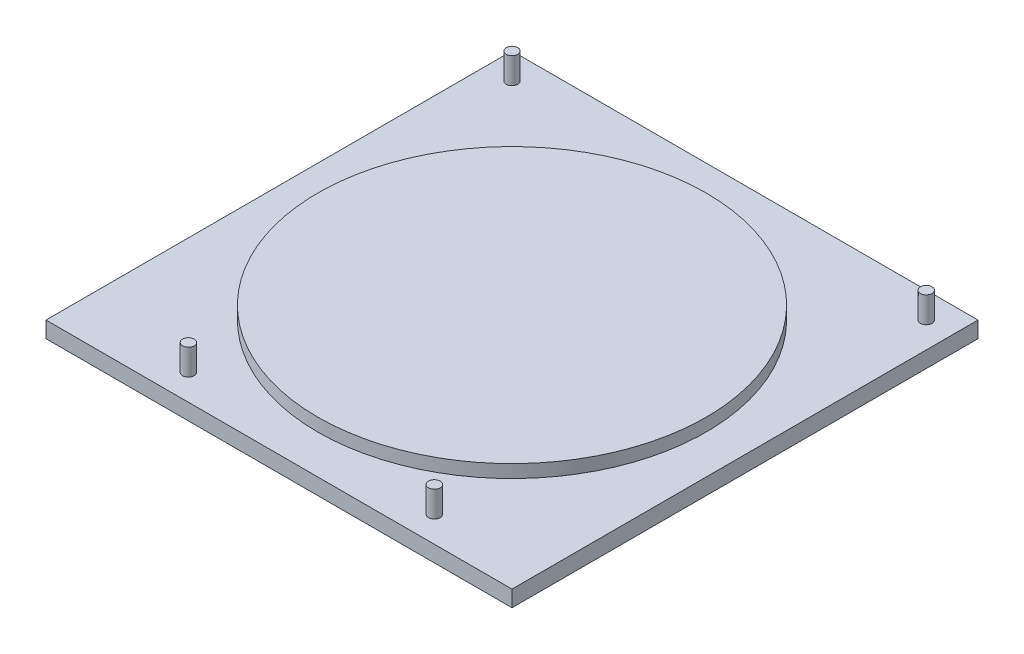
ISO-10303-21;
HEADER;
FILE_DESCRIPTION(('STEP AP214'),'2;1');
FILE_NAME('part.step','',(''),(''),'','','');
FILE_SCHEMA(('AUTOMOTIVE_DESIGN { 1 0 10303 214 1 1 1 1 }'));
ENDSEC;
DATA;
#1=APPLICATION_CONTEXT('core data for automotive mechanical design processes');
#2=APPLICATION_PROTOCOL_DEFINITION('international standard','automotive_design',2000,#1);
#3=PRODUCT_CONTEXT('',#1,'mechanical');
#4=PRODUCT('Part','Part','',(#3));
#5=PRODUCT_RELATED_PRODUCT_CATEGORY('part','',(#4));
#6=PRODUCT_DEFINITION_FORMATION('','',#4);
#7=PRODUCT_DEFINITION_CONTEXT('part definition',#1,'design');
#8=PRODUCT_DEFINITION('design','',#6,#7);
#9=PRODUCT_DEFINITION_SHAPE('','',#8);
#10=(LENGTH_UNIT() NAMED_UNIT(*) SI_UNIT(.MILLI.,.METRE.));
#11=(NAMED_UNIT(*) PLANE_ANGLE_UNIT() SI_UNIT($,.RADIAN.));
#12=(NAMED_UNIT(*) SI_UNIT($,.STERADIAN.) SOLID_ANGLE_UNIT());
#13=UNCERTAINTY_MEASURE_WITH_UNIT(LENGTH_MEASURE(1.E-05),#10,'distance_accuracy_value','');
#14=(GEOMETRIC_REPRESENTATION_CONTEXT(3) GLOBAL_UNCERTAINTY_ASSIGNED_CONTEXT((#13)) GLOBAL_UNIT_ASSIGNED_CONTEXT((#10,
#11,#12)) REPRESENTATION_CONTEXT('',''));
#15=CARTESIAN_POINT('',(0.,0.,0.));
#16=DIRECTION('',(0.,0.,1.));
#17=DIRECTION('',(1.,0.,0.));
#18=AXIS2_PLACEMENT_3D('',#15,#16,#17);
#19=CARTESIAN_POINT('',(-13.556511627907,3.175,-42.9289534883721));
#20=DIRECTION('',(1.,0.,0.));
#21=DIRECTION('',(0.,0.,-1.));
#22=AXIS2_PLACEMENT_3D('',#19,#20,#21);
#23=PLANE('',#22);
#24=DIRECTION('',(0.,0.,1.));
#25=VECTOR('',#24,1.);
#26=CARTESIAN_POINT('',(-13.556511627907,0.,-42.9289534883721));
#27=LINE('',#26,#25);
#28=CARTESIAN_POINT('',(-13.556511627907,0.,-42.9289534883721));
#29=VERTEX_POINT('',#28);
#30=CARTESIAN_POINT('',(-13.556511627907,0.,48.5110465116279));
#31=VERTEX_POINT('',#30);
#32=EDGE_CURVE('E114',#29,#31,#27,.T.);
#33=ORIENTED_EDGE('',*,*,#32,.T.);
#34=DIRECTION('',(0.,-1.,0.));
#35=VECTOR('',#34,1.);
#36=CARTESIAN_POINT('',(-13.556511627907,3.175,48.5110465116279));
#37=LINE('',#36,#35);
#38=CARTESIAN_POINT('',(-13.556511627907,3.175,48.5110465116279));
#39=VERTEX_POINT('',#38);
#40=EDGE_CURVE('E46',#39,#31,#37,.T.);
#41=ORIENTED_EDGE('',*,*,#40,.F.);
#42=DIRECTION('',(0.,0.,1.));
#43=VECTOR('',#42,1.);
#44=CARTESIAN_POINT('',(-13.556511627907,3.175,-42.9289534883721));
#45=LINE('',#44,#43);
#46=CARTESIAN_POINT('',(-13.556511627907,3.175,-42.9289534883721));
#47=VERTEX_POINT('',#46);
#48=EDGE_CURVE('E97',#47,#39,#45,.T.);
#49=ORIENTED_EDGE('',*,*,#48,.F.);
#50=DIRECTION('',(0.,-1.,0.));
#51=VECTOR('',#50,1.);
#52=CARTESIAN_POINT('',(-13.556511627907,3.175,-42.9289534883721));
#53=LINE('',#52,#51);
#54=EDGE_CURVE('E110',#47,#29,#53,.T.);
#55=ORIENTED_EDGE('',*,*,#54,.T.);
#56=EDGE_LOOP('',(#33,#41,#49,#55));
#57=FACE_BOUND('',#56,.T.);
#58=ADVANCED_FACE('F43',(#57),#23,.F.);
#59=CARTESIAN_POINT('',(-13.556511627907,3.175,48.5110465116279));
#60=DIRECTION('',(0.,0.,-1.));
#61=DIRECTION('',(-1.,0.,0.));
#62=AXIS2_PLACEMENT_3D('',#59,#60,#61);
#63=PLANE('',#62);
#64=DIRECTION('',(1.,0.,0.));
#65=VECTOR('',#64,1.);
#66=CARTESIAN_POINT('',(-13.556511627907,0.,48.5110465116279));
#67=LINE('',#66,#65);
#68=CARTESIAN_POINT('',(77.883488372093,0.,48.5110465116279));
#69=VERTEX_POINT('',#68);
#70=EDGE_CURVE('E103',#31,#69,#67,.T.);
#71=ORIENTED_EDGE('',*,*,#70,.T.);
#72=DIRECTION('',(0.,-1.,0.));
#73=VECTOR('',#72,1.);
#74=CARTESIAN_POINT('',(77.883488372093,3.175,48.5110465116279));
#75=LINE('',#74,#73);
#76=CARTESIAN_POINT('',(77.883488372093,3.175,48.5110465116279));
#77=VERTEX_POINT('',#76);
#78=EDGE_CURVE('E101',#77,#69,#75,.T.);
#79=ORIENTED_EDGE('',*,*,#78,.F.);
#80=DIRECTION('',(1.,0.,0.));
#81=VECTOR('',#80,1.);
#82=CARTESIAN_POINT('',(-13.556511627907,3.175,48.5110465116279));
#83=LINE('',#82,#81);
#84=EDGE_CURVE('E92',#39,#77,#83,.T.);
#85=ORIENTED_EDGE('',*,*,#84,.F.);
#86=ORIENTED_EDGE('',*,*,#40,.T.);
#87=EDGE_LOOP('',(#71,#79,#85,#86));
#88=FACE_BOUND('',#87,.T.);
#89=ADVANCED_FACE('F102',(#88),#63,.F.);
#90=CARTESIAN_POINT('',(77.883488372093,3.175,-42.9289534883721));
#91=DIRECTION('',(-1.,0.,0.));
#92=DIRECTION('',(0.,0.,1.));
#93=AXIS2_PLACEMENT_3D('',#90,#91,#92);
#94=PLANE('',#93);
#95=DIRECTION('',(0.,0.,-1.));
#96=VECTOR('',#95,1.);
#97=CARTESIAN_POINT('',(77.883488372093,0.,-42.9289534883721));
#98=LINE('',#97,#96);
#99=CARTESIAN_POINT('',(77.883488372093,0.,-42.9289534883721));
#100=VERTEX_POINT('',#99);
#101=EDGE_CURVE('E78',#69,#100,#98,.T.);
#102=ORIENTED_EDGE('',*,*,#101,.T.);
#103=DIRECTION('',(0.,-1.,0.));
#104=VECTOR('',#103,1.);
#105=CARTESIAN_POINT('',(77.883488372093,3.175,-42.9289534883721));
#106=LINE('',#105,#104);
#107=CARTESIAN_POINT('',(77.883488372093,3.175,-42.9289534883721));
#108=VERTEX_POINT('',#107);
#109=EDGE_CURVE('E105',#108,#100,#106,.T.);
#110=ORIENTED_EDGE('',*,*,#109,.F.);
#111=DIRECTION('',(0.,0.,-1.));
#112=VECTOR('',#111,1.);
#113=CARTESIAN_POINT('',(77.883488372093,3.175,-42.9289534883721));
#114=LINE('',#113,#112);
#115=EDGE_CURVE('E95',#77,#108,#114,.T.);
#116=ORIENTED_EDGE('',*,*,#115,.F.);
#117=ORIENTED_EDGE('',*,*,#78,.T.);
#118=EDGE_LOOP('',(#102,#110,#116,#117));
#119=FACE_BOUND('',#118,.T.);
#120=ADVANCED_FACE('F106',(#119),#94,.F.);
#121=CARTESIAN_POINT('',(-13.556511627907,3.175,-42.9289534883721));
#122=DIRECTION('',(0.,0.,1.));
#123=DIRECTION('',(1.,0.,0.));
#124=AXIS2_PLACEMENT_3D('',#121,#122,#123);
#125=PLANE('',#124);
#126=DIRECTION('',(-1.,0.,0.));
#127=VECTOR('',#126,1.);
#128=CARTESIAN_POINT('',(-13.556511627907,0.,-42.9289534883721));
#129=LINE('',#128,#127);
#130=EDGE_CURVE('E84',#100,#29,#129,.T.);
#131=ORIENTED_EDGE('',*,*,#130,.T.);
#132=ORIENTED_EDGE('',*,*,#54,.F.);
#133=DIRECTION('',(-1.,0.,0.));
#134=VECTOR('',#133,1.);
#135=CARTESIAN_POINT('',(-13.556511627907,3.175,-42.9289534883721));
#136=LINE('',#135,#134);
#137=EDGE_CURVE('E61',#108,#47,#136,.T.);
#138=ORIENTED_EDGE('',*,*,#137,.F.);
#139=ORIENTED_EDGE('',*,*,#109,.T.);
#140=EDGE_LOOP('',(#131,#132,#138,#139));
#141=FACE_BOUND('',#140,.T.);
#142=ADVANCED_FACE('F128',(#141),#125,.F.);
#143=CARTESIAN_POINT('',(0.,3.175,0.));
#144=DIRECTION('',(0.,1.,0.));
#145=DIRECTION('',(0.,0.,1.));
#146=AXIS2_PLACEMENT_3D('',#143,#144,#145);
#147=PLANE('',#146);
#148=CARTESIAN_POINT('',(72.803488372093,3.175,-37.8489534883721));
#149=DIRECTION('',(0.,1.,0.));
#150=DIRECTION('',(0.,0.,1.));
#151=AXIS2_PLACEMENT_3D('',#148,#149,#150);
#152=CIRCLE('',#151,1.143);
#153=CARTESIAN_POINT('',(72.803488372093,3.175,-36.7059534883721));
#154=VERTEX_POINT('',#153);
#155=EDGE_CURVE('E159',#154,#154,#152,.T.);
#156=ORIENTED_EDGE('',*,*,#155,.F.);
#157=EDGE_LOOP('',(#156));
#158=FACE_BOUND('',#157,.T.);
#159=CARTESIAN_POINT('',(-8.476511627907,3.175,-37.8489534883721));
#160=DIRECTION('',(0.,1.,0.));
#161=DIRECTION('',(0.,0.,1.));
#162=AXIS2_PLACEMENT_3D('',#159,#160,#161);
#163=CIRCLE('',#162,1.143);
#164=CARTESIAN_POINT('',(-8.476511627907,3.175,-36.7059534883721));
#165=VERTEX_POINT('',#164);
#166=EDGE_CURVE('E155',#165,#165,#163,.T.);
#167=ORIENTED_EDGE('',*,*,#166,.F.);
#168=EDGE_LOOP('',(#167));
#169=FACE_BOUND('',#168,.T.);
#170=CARTESIAN_POINT('',(57.563488372093,3.175,43.4310465116279));
#171=DIRECTION('',(0.,1.,0.));
#172=DIRECTION('',(0.,0.,1.));
#173=AXIS2_PLACEMENT_3D('',#170,#171,#172);
#174=CIRCLE('',#173,1.143);
#175=CARTESIAN_POINT('',(57.563488372093,3.175,44.5740465116279));
#176=VERTEX_POINT('',#175);
#177=EDGE_CURVE('E143',#176,#176,#174,.T.);
#178=ORIENTED_EDGE('',*,*,#177,.F.);
#179=EDGE_LOOP('',(#178));
#180=FACE_BOUND('',#179,.T.);
#181=CARTESIAN_POINT('',(9.30348837209301,3.175,43.4310465116279));
#182=DIRECTION('',(0.,1.,0.));
#183=DIRECTION('',(0.,0.,1.));
#184=AXIS2_PLACEMENT_3D('',#181,#182,#183);
#185=CIRCLE('',#184,1.143);
#186=CARTESIAN_POINT('',(9.30348837209301,3.175,44.5740465116279));
#187=VERTEX_POINT('',#186);
#188=EDGE_CURVE('E139',#187,#187,#185,.T.);
#189=ORIENTED_EDGE('',*,*,#188,.F.);
#190=EDGE_LOOP('',(#189));
#191=FACE_BOUND('',#190,.T.);
#192=CARTESIAN_POINT('',(32.163488372093,3.175,2.79104651162791));
#193=DIRECTION('',(0.,1.,0.));
#194=DIRECTION('',(0.,0.,1.));
#195=AXIS2_PLACEMENT_3D('',#192,#193,#194);
#196=CIRCLE('',#195,38.1);
#197=CARTESIAN_POINT('',(32.163488372093,3.175,40.8910465116279));
#198=VERTEX_POINT('',#197);
#199=EDGE_CURVE('E11',#198,#198,#196,.T.);
#200=ORIENTED_EDGE('',*,*,#199,.F.);
#201=EDGE_LOOP('',(#200));
#202=FACE_BOUND('',#201,.T.);
#203=ORIENTED_EDGE('',*,*,#48,.T.);
#204=ORIENTED_EDGE('',*,*,#84,.T.);
#205=ORIENTED_EDGE('',*,*,#115,.T.);
#206=ORIENTED_EDGE('',*,*,#137,.T.);
#207=EDGE_LOOP('',(#203,#204,#205,#206));
#208=FACE_BOUND('',#207,.T.);
#209=ADVANCED_FACE('F93',(#158,#169,#180,#191,#202,#208),#147,.T.);
#210=CARTESIAN_POINT('',(0.,0.,0.));
#211=DIRECTION('',(0.,1.,0.));
#212=DIRECTION('',(0.,0.,1.));
#213=AXIS2_PLACEMENT_3D('',#210,#211,#212);
#214=PLANE('',#213);
#215=ORIENTED_EDGE('',*,*,#32,.F.);
#216=ORIENTED_EDGE('',*,*,#130,.F.);
#217=ORIENTED_EDGE('',*,*,#101,.F.);
#218=ORIENTED_EDGE('',*,*,#70,.F.);
#219=EDGE_LOOP('',(#215,#216,#217,#218));
#220=FACE_BOUND('',#219,.T.);
#221=ADVANCED_FACE('F131',(#220),#214,.F.);
#222=CARTESIAN_POINT('',(32.163488372093,5.715,2.79104651162791));
#223=DIRECTION('',(0.,-1.,0.));
#224=DIRECTION('',(0.,0.,-1.));
#225=AXIS2_PLACEMENT_3D('',#222,#223,#224);
#226=CYLINDRICAL_SURFACE('',#225,38.1);
#227=CARTESIAN_POINT('',(32.163488372093,5.715,2.79104651162791));
#228=DIRECTION('',(0.,1.,0.));
#229=DIRECTION('',(0.,0.,1.));
#230=AXIS2_PLACEMENT_3D('',#227,#228,#229);
#231=CIRCLE('',#230,38.1);
#232=CARTESIAN_POINT('',(32.163488372093,5.715,40.8910465116279));
#233=VERTEX_POINT('',#232);
#234=EDGE_CURVE('E118',#233,#233,#231,.T.);
#235=ORIENTED_EDGE('',*,*,#234,.F.);
#236=EDGE_LOOP('',(#235));
#237=FACE_BOUND('',#236,.T.);
#238=ORIENTED_EDGE('',*,*,#199,.T.);
#239=EDGE_LOOP('',(#238));
#240=FACE_BOUND('',#239,.T.);
#241=ADVANCED_FACE('F184',(#237,#240),#226,.T.);
#242=CARTESIAN_POINT('',(32.163488372093,5.715,2.79104651162791));
#243=DIRECTION('',(0.,1.,0.));
#244=DIRECTION('',(0.,0.,1.));
#245=AXIS2_PLACEMENT_3D('',#242,#243,#244);
#246=PLANE('',#245);
#247=ORIENTED_EDGE('',*,*,#234,.T.);
#248=EDGE_LOOP('',(#247));
#249=FACE_BOUND('',#248,.T.);
#250=ADVANCED_FACE('F186',(#249),#246,.T.);
#251=CARTESIAN_POINT('',(9.30348837209301,8.255,43.4310465116279));
#252=DIRECTION('',(0.,-1.,0.));
#253=DIRECTION('',(0.,0.,-1.));
#254=AXIS2_PLACEMENT_3D('',#251,#252,#253);
#255=CYLINDRICAL_SURFACE('',#254,1.143);
#256=CARTESIAN_POINT('',(9.30348837209301,8.255,43.4310465116279));
#257=DIRECTION('',(0.,1.,0.));
#258=DIRECTION('',(0.,0.,1.));
#259=AXIS2_PLACEMENT_3D('',#256,#257,#258);
#260=CIRCLE('',#259,1.143);
#261=CARTESIAN_POINT('',(9.30348837209301,8.255,44.5740465116279));
#262=VERTEX_POINT('',#261);
#263=EDGE_CURVE('E138',#262,#262,#260,.T.);
#264=ORIENTED_EDGE('',*,*,#263,.F.);
#265=EDGE_LOOP('',(#264));
#266=FACE_BOUND('',#265,.T.);
#267=ORIENTED_EDGE('',*,*,#188,.T.);
#268=EDGE_LOOP('',(#267));
#269=FACE_BOUND('',#268,.T.);
#270=ADVANCED_FACE('F193',(#266,#269),#255,.T.);
#271=CARTESIAN_POINT('',(9.30348837209301,8.255,43.4310465116279));
#272=DIRECTION('',(0.,1.,0.));
#273=DIRECTION('',(0.,0.,1.));
#274=AXIS2_PLACEMENT_3D('',#271,#272,#273);
#275=PLANE('',#274);
#276=ORIENTED_EDGE('',*,*,#263,.T.);
#277=EDGE_LOOP('',(#276));
#278=FACE_BOUND('',#277,.T.);
#279=ADVANCED_FACE('F244',(#278),#275,.T.);
#280=CARTESIAN_POINT('',(57.563488372093,8.255,43.4310465116279));
#281=DIRECTION('',(0.,-1.,0.));
#282=DIRECTION('',(0.,0.,-1.));
#283=AXIS2_PLACEMENT_3D('',#280,#281,#282);
#284=CYLINDRICAL_SURFACE('',#283,1.143);
#285=CARTESIAN_POINT('',(57.563488372093,8.255,43.4310465116279));
#286=DIRECTION('',(0.,1.,0.));
#287=DIRECTION('',(0.,0.,1.));
#288=AXIS2_PLACEMENT_3D('',#285,#286,#287);
#289=CIRCLE('',#288,1.143);
#290=CARTESIAN_POINT('',(57.563488372093,8.255,44.5740465116279));
#291=VERTEX_POINT('',#290);
#292=EDGE_CURVE('E147',#291,#291,#289,.T.);
#293=ORIENTED_EDGE('',*,*,#292,.F.);
#294=EDGE_LOOP('',(#293));
#295=FACE_BOUND('',#294,.T.);
#296=ORIENTED_EDGE('',*,*,#177,.T.);
#297=EDGE_LOOP('',(#296));
#298=FACE_BOUND('',#297,.T.);
#299=ADVANCED_FACE('F255',(#295,#298),#284,.T.);
#300=CARTESIAN_POINT('',(57.563488372093,8.255,43.4310465116279));
#301=DIRECTION('',(0.,1.,0.));
#302=DIRECTION('',(0.,0.,1.));
#303=AXIS2_PLACEMENT_3D('',#300,#301,#302);
#304=PLANE('',#303);
#305=ORIENTED_EDGE('',*,*,#292,.T.);
#306=EDGE_LOOP('',(#305));
#307=FACE_BOUND('',#306,.T.);
#308=ADVANCED_FACE('F265',(#307),#304,.T.);
#309=CARTESIAN_POINT('',(-8.476511627907,8.255,-37.8489534883721));
#310=DIRECTION('',(0.,-1.,0.));
#311=DIRECTION('',(0.,0.,-1.));
#312=AXIS2_PLACEMENT_3D('',#309,#310,#311);
#313=CYLINDRICAL_SURFACE('',#312,1.143);
#314=CARTESIAN_POINT('',(-8.476511627907,8.255,-37.8489534883721));
#315=DIRECTION('',(0.,1.,0.));
#316=DIRECTION('',(0.,0.,1.));
#317=AXIS2_PLACEMENT_3D('',#314,#315,#316);
#318=CIRCLE('',#317,1.143);
#319=CARTESIAN_POINT('',(-8.476511627907,8.255,-36.7059534883721));
#320=VERTEX_POINT('',#319);
#321=EDGE_CURVE('E151',#320,#320,#318,.T.);
#322=ORIENTED_EDGE('',*,*,#321,.F.);
#323=EDGE_LOOP('',(#322));
#324=FACE_BOUND('',#323,.T.);
#325=ORIENTED_EDGE('',*,*,#166,.T.);
#326=EDGE_LOOP('',(#325));
#327=FACE_BOUND('',#326,.T.);
#328=ADVANCED_FACE('F275',(#324,#327),#313,.T.);
#329=CARTESIAN_POINT('',(-8.476511627907,8.255,-37.8489534883721));
#330=DIRECTION('',(0.,1.,0.));
#331=DIRECTION('',(0.,0.,1.));
#332=AXIS2_PLACEMENT_3D('',#329,#330,#331);
#333=PLANE('',#332);
#334=ORIENTED_EDGE('',*,*,#321,.T.);
#335=EDGE_LOOP('',(#334));
#336=FACE_BOUND('',#335,.T.);
#337=ADVANCED_FACE('F286',(#336),#333,.T.);
#338=CARTESIAN_POINT('',(72.803488372093,8.255,-37.8489534883721));
#339=DIRECTION('',(0.,-1.,0.));
#340=DIRECTION('',(0.,0.,-1.));
#341=AXIS2_PLACEMENT_3D('',#338,#339,#340);
#342=CYLINDRICAL_SURFACE('',#341,1.143);
#343=CARTESIAN_POINT('',(72.803488372093,8.255,-37.8489534883721));
#344=DIRECTION('',(0.,1.,0.));
#345=DIRECTION('',(0.,0.,1.));
#346=AXIS2_PLACEMENT_3D('',#343,#344,#345);
#347=CIRCLE('',#346,1.143);
#348=CARTESIAN_POINT('',(72.803488372093,8.255,-36.7059534883721));
#349=VERTEX_POINT('',#348);
#350=EDGE_CURVE('E163',#349,#349,#347,.T.);
#351=ORIENTED_EDGE('',*,*,#350,.F.);
#352=EDGE_LOOP('',(#351));
#353=FACE_BOUND('',#352,.T.);
#354=ORIENTED_EDGE('',*,*,#155,.T.);
#355=EDGE_LOOP('',(#354));
#356=FACE_BOUND('',#355,.T.);
#357=ADVANCED_FACE('F171',(#353,#356),#342,.T.);
#358=CARTESIAN_POINT('',(72.803488372093,8.255,-37.8489534883721));
#359=DIRECTION('',(0.,1.,0.));
#360=DIRECTION('',(0.,0.,1.));
#361=AXIS2_PLACEMENT_3D('',#358,#359,#360);
#362=PLANE('',#361);
#363=ORIENTED_EDGE('',*,*,#350,.T.);
#364=EDGE_LOOP('',(#363));
#365=FACE_BOUND('',#364,.T.);
#366=ADVANCED_FACE('F300',(#365),#362,.T.);
#367=CLOSED_SHELL('',(#58,#89,#120,#142,#209,#221,#241,#250,#270,#279,#299,#308,#328,#337,#357,#366));
#368=MANIFOLD_SOLID_BREP('B2',#367);
#369=ADVANCED_BREP_SHAPE_REPRESENTATION('',(#18,#368),#14);
#370=SHAPE_DEFINITION_REPRESENTATION(#9,#369);
ENDSEC;
END-ISO-10303-21;
